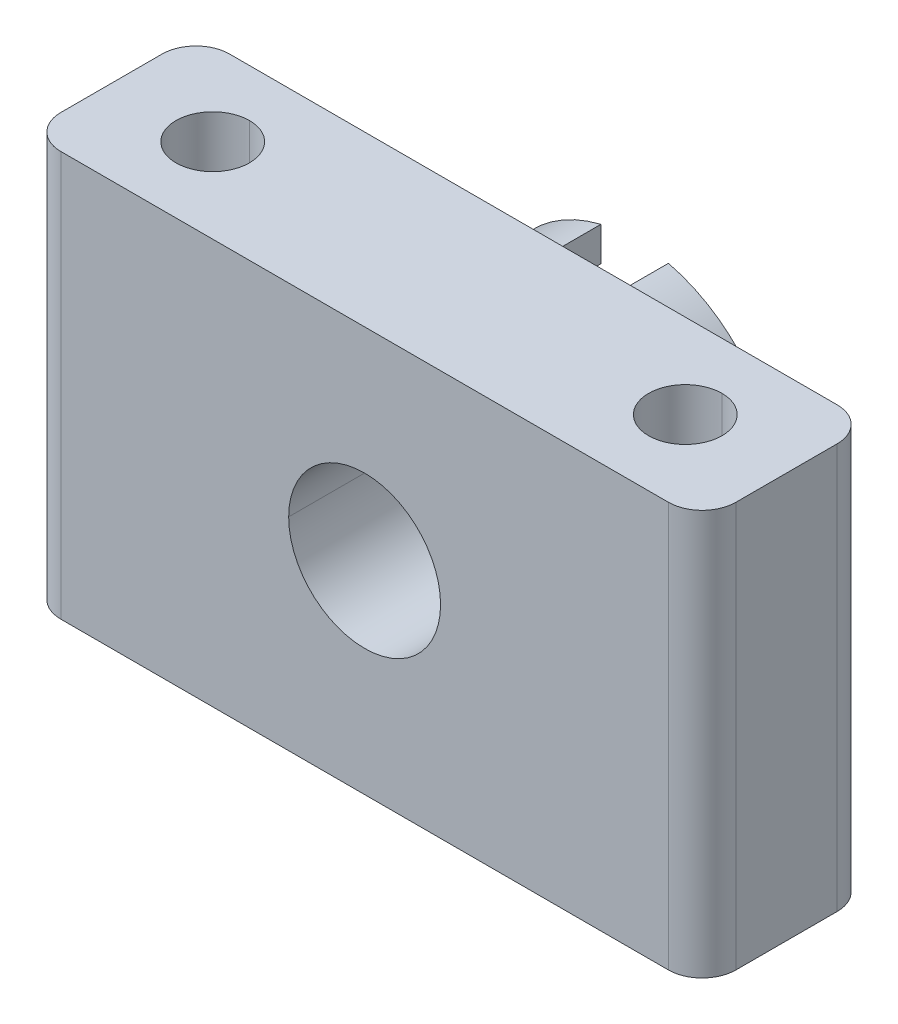
ISO-10303-21;
HEADER;
FILE_DESCRIPTION(('STEP AP214'),'2;1');
FILE_NAME('part.step','',(''),(''),'','','');
FILE_SCHEMA(('AUTOMOTIVE_DESIGN { 1 0 10303 214 1 1 1 1 }'));
ENDSEC;
DATA;
#1=APPLICATION_CONTEXT('core data for automotive mechanical design processes');
#2=APPLICATION_PROTOCOL_DEFINITION('international standard','automotive_design',2000,#1);
#3=PRODUCT_CONTEXT('',#1,'mechanical');
#4=PRODUCT('Part','Part','',(#3));
#5=PRODUCT_RELATED_PRODUCT_CATEGORY('part','',(#4));
#6=PRODUCT_DEFINITION_FORMATION('','',#4);
#7=PRODUCT_DEFINITION_CONTEXT('part definition',#1,'design');
#8=PRODUCT_DEFINITION('design','',#6,#7);
#9=PRODUCT_DEFINITION_SHAPE('','',#8);
#10=(LENGTH_UNIT() NAMED_UNIT(*) SI_UNIT(.MILLI.,.METRE.));
#11=(NAMED_UNIT(*) PLANE_ANGLE_UNIT() SI_UNIT($,.RADIAN.));
#12=(NAMED_UNIT(*) SI_UNIT($,.STERADIAN.) SOLID_ANGLE_UNIT());
#13=UNCERTAINTY_MEASURE_WITH_UNIT(LENGTH_MEASURE(1.E-05),#10,'distance_accuracy_value','');
#14=(GEOMETRIC_REPRESENTATION_CONTEXT(3) GLOBAL_UNCERTAINTY_ASSIGNED_CONTEXT((#13)) GLOBAL_UNIT_ASSIGNED_CONTEXT((#10,
#11,#12)) REPRESENTATION_CONTEXT('',''));
#15=CARTESIAN_POINT('',(0.,0.,0.));
#16=DIRECTION('',(0.,0.,1.));
#17=DIRECTION('',(1.,0.,0.));
#18=AXIS2_PLACEMENT_3D('',#15,#16,#17);
#19=CARTESIAN_POINT('',(-14.,-28.,11.));
#20=DIRECTION('',(0.,1.,0.));
#21=DIRECTION('',(0.,0.,1.));
#22=AXIS2_PLACEMENT_3D('',#19,#20,#21);
#23=CYLINDRICAL_SURFACE('',#22,2.175);
#24=CARTESIAN_POINT('',(-14.,-12.,11.));
#25=DIRECTION('',(0.,1.,0.));
#26=DIRECTION('',(0.,0.,1.));
#27=AXIS2_PLACEMENT_3D('',#24,#25,#26);
#28=CIRCLE('',#27,2.175);
#29=CARTESIAN_POINT('',(-14.,-12.,8.825));
#30=VERTEX_POINT('',#29);
#31=CARTESIAN_POINT('',(-14.,-12.,13.175));
#32=VERTEX_POINT('',#31);
#33=EDGE_CURVE('E302',#30,#32,#28,.T.);
#34=ORIENTED_EDGE('',*,*,#33,.F.);
#35=DIRECTION('',(0.,1.,0.));
#36=VECTOR('',#35,1.);
#37=CARTESIAN_POINT('',(-14.,-28.,8.825));
#38=LINE('',#37,#36);
#39=CARTESIAN_POINT('',(-14.,12.,8.825));
#40=VERTEX_POINT('',#39);
#41=EDGE_CURVE('E232',#30,#40,#38,.T.);
#42=ORIENTED_EDGE('',*,*,#41,.T.);
#43=CARTESIAN_POINT('',(-14.,12.,11.));
#44=DIRECTION('',(0.,1.,0.));
#45=DIRECTION('',(0.,0.,1.));
#46=AXIS2_PLACEMENT_3D('',#43,#44,#45);
#47=CIRCLE('',#46,2.175);
#48=CARTESIAN_POINT('',(-14.,12.,13.175));
#49=VERTEX_POINT('',#48);
#50=EDGE_CURVE('E11',#40,#49,#47,.T.);
#51=ORIENTED_EDGE('',*,*,#50,.T.);
#52=DIRECTION('',(0.,1.,0.));
#53=VECTOR('',#52,1.);
#54=CARTESIAN_POINT('',(-14.,-28.,13.175));
#55=LINE('',#54,#53);
#56=EDGE_CURVE('E291',#32,#49,#55,.T.);
#57=ORIENTED_EDGE('',*,*,#56,.F.);
#58=EDGE_LOOP('',(#34,#42,#51,#57));
#59=FACE_BOUND('',#58,.T.);
#60=ADVANCED_FACE('F16',(#59),#23,.F.);
#61=CARTESIAN_POINT('',(14.,-28.,11.));
#62=DIRECTION('',(0.,1.,0.));
#63=DIRECTION('',(0.,0.,1.));
#64=AXIS2_PLACEMENT_3D('',#61,#62,#63);
#65=CYLINDRICAL_SURFACE('',#64,2.175);
#66=CARTESIAN_POINT('',(14.,-12.,11.));
#67=DIRECTION('',(0.,1.,0.));
#68=DIRECTION('',(0.,0.,1.));
#69=AXIS2_PLACEMENT_3D('',#66,#67,#68);
#70=CIRCLE('',#69,2.175);
#71=CARTESIAN_POINT('',(14.,-12.,8.825));
#72=VERTEX_POINT('',#71);
#73=CARTESIAN_POINT('',(14.,-12.,13.175));
#74=VERTEX_POINT('',#73);
#75=EDGE_CURVE('E299',#72,#74,#70,.T.);
#76=ORIENTED_EDGE('',*,*,#75,.F.);
#77=DIRECTION('',(0.,1.,0.));
#78=VECTOR('',#77,1.);
#79=CARTESIAN_POINT('',(14.,-28.,8.825));
#80=LINE('',#79,#78);
#81=CARTESIAN_POINT('',(14.,12.,8.825));
#82=VERTEX_POINT('',#81);
#83=EDGE_CURVE('E290',#72,#82,#80,.T.);
#84=ORIENTED_EDGE('',*,*,#83,.T.);
#85=CARTESIAN_POINT('',(14.,12.,11.));
#86=DIRECTION('',(0.,1.,0.));
#87=DIRECTION('',(0.,0.,-1.));
#88=AXIS2_PLACEMENT_3D('',#85,#86,#87);
#89=CIRCLE('',#88,2.175);
#90=CARTESIAN_POINT('',(14.,12.,13.175));
#91=VERTEX_POINT('',#90);
#92=EDGE_CURVE('E27',#82,#91,#89,.T.);
#93=ORIENTED_EDGE('',*,*,#92,.T.);
#94=DIRECTION('',(0.,1.,0.));
#95=VECTOR('',#94,1.);
#96=CARTESIAN_POINT('',(14.,-28.,13.175));
#97=LINE('',#96,#95);
#98=EDGE_CURVE('E383',#74,#91,#97,.T.);
#99=ORIENTED_EDGE('',*,*,#98,.F.);
#100=EDGE_LOOP('',(#76,#84,#93,#99));
#101=FACE_BOUND('',#100,.T.);
#102=ADVANCED_FACE('F502',(#101),#65,.F.);
#103=CARTESIAN_POINT('',(0.,0.,18.));
#104=DIRECTION('',(0.,0.,-1.));
#105=DIRECTION('',(-1.,0.,0.));
#106=AXIS2_PLACEMENT_3D('',#103,#104,#105);
#107=CYLINDRICAL_SURFACE('',#106,4.5);
#108=CARTESIAN_POINT('',(0.,0.,16.));
#109=DIRECTION('',(0.,0.,-1.));
#110=DIRECTION('',(-1.,0.,0.));
#111=AXIS2_PLACEMENT_3D('',#108,#109,#110);
#112=CIRCLE('',#111,4.5);
#113=CARTESIAN_POINT('',(4.5,0.,16.));
#114=VERTEX_POINT('',#113);
#115=CARTESIAN_POINT('',(-4.5,0.,16.));
#116=VERTEX_POINT('',#115);
#117=EDGE_CURVE('E242',#114,#116,#112,.T.);
#118=ORIENTED_EDGE('',*,*,#117,.F.);
#119=DIRECTION('',(0.,0.,-1.));
#120=VECTOR('',#119,1.);
#121=CARTESIAN_POINT('',(4.5,0.,18.));
#122=LINE('',#121,#120);
#123=CARTESIAN_POINT('',(4.5,0.,9.));
#124=VERTEX_POINT('',#123);
#125=EDGE_CURVE('E339',#114,#124,#122,.T.);
#126=ORIENTED_EDGE('',*,*,#125,.T.);
#127=CARTESIAN_POINT('',(0.,0.,9.));
#128=DIRECTION('',(0.,0.,-1.));
#129=DIRECTION('',(-1.,0.,0.));
#130=AXIS2_PLACEMENT_3D('',#127,#128,#129);
#131=CIRCLE('',#130,4.5);
#132=CARTESIAN_POINT('',(-4.5,0.,9.));
#133=VERTEX_POINT('',#132);
#134=EDGE_CURVE('E248',#124,#133,#131,.T.);
#135=ORIENTED_EDGE('',*,*,#134,.T.);
#136=DIRECTION('',(0.,0.,-1.));
#137=VECTOR('',#136,1.);
#138=CARTESIAN_POINT('',(-4.5,0.,18.));
#139=LINE('',#138,#137);
#140=EDGE_CURVE('E371',#116,#133,#139,.T.);
#141=ORIENTED_EDGE('',*,*,#140,.F.);
#142=EDGE_LOOP('',(#118,#126,#135,#141));
#143=FACE_BOUND('',#142,.T.);
#144=ADVANCED_FACE('F561',(#143),#107,.F.);
#145=CARTESIAN_POINT('',(0.,0.,-2.00000000000003));
#146=DIRECTION('',(0.,0.,1.));
#147=DIRECTION('',(1.,0.,0.));
#148=AXIS2_PLACEMENT_3D('',#145,#146,#147);
#149=CYLINDRICAL_SURFACE('',#148,8.5);
#150=CARTESIAN_POINT('',(0.,0.,0.));
#151=DIRECTION('',(0.,0.,-1.));
#152=DIRECTION('',(-1.,0.,0.));
#153=AXIS2_PLACEMENT_3D('',#150,#151,#152);
#154=CIRCLE('',#153,8.5);
#155=CARTESIAN_POINT('',(8.5,0.,0.));
#156=VERTEX_POINT('',#155);
#157=CARTESIAN_POINT('',(2.,-8.26135582092915,0.));
#158=VERTEX_POINT('',#157);
#159=EDGE_CURVE('E261',#156,#158,#154,.T.);
#160=ORIENTED_EDGE('',*,*,#159,.F.);
#161=DIRECTION('',(0.,0.,1.));
#162=VECTOR('',#161,1.);
#163=CARTESIAN_POINT('',(8.5,0.,-2.00000000000003));
#164=LINE('',#163,#162);
#165=CARTESIAN_POINT('',(8.5,0.,6.));
#166=VERTEX_POINT('',#165);
#167=EDGE_CURVE('E42',#156,#166,#164,.T.);
#168=ORIENTED_EDGE('',*,*,#167,.T.);
#169=CARTESIAN_POINT('',(0.,0.,6.));
#170=DIRECTION('',(0.,0.,1.));
#171=DIRECTION('',(1.,0.,0.));
#172=AXIS2_PLACEMENT_3D('',#169,#170,#171);
#173=CIRCLE('',#172,8.5);
#174=CARTESIAN_POINT('',(2.,-8.26135582092915,6.));
#175=VERTEX_POINT('',#174);
#176=EDGE_CURVE('E208',#175,#166,#173,.T.);
#177=ORIENTED_EDGE('',*,*,#176,.F.);
#178=DIRECTION('',(0.,0.,1.));
#179=VECTOR('',#178,1.);
#180=CARTESIAN_POINT('',(2.,-8.26135582092915,-2.00000000000003));
#181=LINE('',#180,#179);
#182=EDGE_CURVE('E200',#158,#175,#181,.T.);
#183=ORIENTED_EDGE('',*,*,#182,.F.);
#184=EDGE_LOOP('',(#160,#168,#177,#183));
#185=FACE_BOUND('',#184,.T.);
#186=ADVANCED_FACE('F919',(#185),#149,.T.);
#187=CARTESIAN_POINT('',(0.,0.,-2.00000000000003));
#188=DIRECTION('',(0.,0.,1.));
#189=DIRECTION('',(1.,0.,0.));
#190=AXIS2_PLACEMENT_3D('',#187,#188,#189);
#191=CYLINDRICAL_SURFACE('',#190,6.55);
#192=CARTESIAN_POINT('',(0.,0.,0.));
#193=DIRECTION('',(0.,0.,1.));
#194=DIRECTION('',(-1.,0.,0.));
#195=AXIS2_PLACEMENT_3D('',#192,#193,#194);
#196=CIRCLE('',#195,6.55);
#197=CARTESIAN_POINT('',(-6.55,0.,0.));
#198=VERTEX_POINT('',#197);
#199=CARTESIAN_POINT('',(-2.,-6.23718686588753,0.));
#200=VERTEX_POINT('',#199);
#201=EDGE_CURVE('E369',#198,#200,#196,.T.);
#202=ORIENTED_EDGE('',*,*,#201,.F.);
#203=DIRECTION('',(0.,0.,1.));
#204=VECTOR('',#203,1.);
#205=CARTESIAN_POINT('',(-6.55,0.,-2.00000000000003));
#206=LINE('',#205,#204);
#207=CARTESIAN_POINT('',(-6.55,0.,9.));
#208=VERTEX_POINT('',#207);
#209=EDGE_CURVE('E351',#198,#208,#206,.T.);
#210=ORIENTED_EDGE('',*,*,#209,.T.);
#211=CARTESIAN_POINT('',(0.,0.,9.));
#212=DIRECTION('',(0.,0.,-1.));
#213=DIRECTION('',(-1.,0.,0.));
#214=AXIS2_PLACEMENT_3D('',#211,#212,#213);
#215=CIRCLE('',#214,6.55);
#216=CARTESIAN_POINT('',(6.55,0.,9.));
#217=VERTEX_POINT('',#216);
#218=EDGE_CURVE('E356',#217,#208,#215,.T.);
#219=ORIENTED_EDGE('',*,*,#218,.F.);
#220=DIRECTION('',(0.,0.,1.));
#221=VECTOR('',#220,1.);
#222=CARTESIAN_POINT('',(6.55,0.,-2.00000000000003));
#223=LINE('',#222,#221);
#224=CARTESIAN_POINT('',(6.55,0.,0.));
#225=VERTEX_POINT('',#224);
#226=EDGE_CURVE('E350',#225,#217,#223,.T.);
#227=ORIENTED_EDGE('',*,*,#226,.F.);
#228=CARTESIAN_POINT('',(0.,0.,0.));
#229=DIRECTION('',(0.,0.,1.));
#230=DIRECTION('',(-1.,0.,0.));
#231=AXIS2_PLACEMENT_3D('',#228,#229,#230);
#232=CIRCLE('',#231,6.55);
#233=CARTESIAN_POINT('',(2.,-6.23718686588753,0.));
#234=VERTEX_POINT('',#233);
#235=EDGE_CURVE('E195',#234,#225,#232,.T.);
#236=ORIENTED_EDGE('',*,*,#235,.F.);
#237=DIRECTION('',(0.,0.,1.));
#238=VECTOR('',#237,1.);
#239=CARTESIAN_POINT('',(2.,-6.23718686588753,-2.00000000000003));
#240=LINE('',#239,#238);
#241=CARTESIAN_POINT('',(2.,-6.23718686588754,6.));
#242=VERTEX_POINT('',#241);
#243=EDGE_CURVE('E187',#234,#242,#240,.T.);
#244=ORIENTED_EDGE('',*,*,#243,.T.);
#245=CARTESIAN_POINT('',(0.,0.,6.));
#246=DIRECTION('',(0.,0.,1.));
#247=DIRECTION('',(1.,0.,0.));
#248=AXIS2_PLACEMENT_3D('',#245,#246,#247);
#249=CIRCLE('',#248,6.55);
#250=CARTESIAN_POINT('',(-2.,-6.23718686588754,6.));
#251=VERTEX_POINT('',#250);
#252=EDGE_CURVE('E192',#251,#242,#249,.T.);
#253=ORIENTED_EDGE('',*,*,#252,.F.);
#254=DIRECTION('',(0.,0.,1.));
#255=VECTOR('',#254,1.);
#256=CARTESIAN_POINT('',(-2.,-6.23718686588753,-2.00000000000003));
#257=LINE('',#256,#255);
#258=EDGE_CURVE('E394',#200,#251,#257,.T.);
#259=ORIENTED_EDGE('',*,*,#258,.F.);
#260=EDGE_LOOP('',(#202,#210,#219,#227,#236,#244,#253,#259));
#261=FACE_BOUND('',#260,.T.);
#262=ADVANCED_FACE('F190',(#261),#191,.F.);
#263=CARTESIAN_POINT('',(-20.,12.,16.));
#264=DIRECTION('',(0.,1.,0.));
#265=DIRECTION('',(1.,0.,0.));
#266=AXIS2_PLACEMENT_3D('',#263,#264,#265);
#267=PLANE('',#266);
#268=CARTESIAN_POINT('',(-14.,12.,11.));
#269=DIRECTION('',(0.,1.,0.));
#270=DIRECTION('',(0.,0.,1.));
#271=AXIS2_PLACEMENT_3D('',#268,#269,#270);
#272=CIRCLE('',#271,2.175);
#273=EDGE_CURVE('E286',#49,#40,#272,.T.);
#274=ORIENTED_EDGE('',*,*,#273,.F.);
#275=ORIENTED_EDGE('',*,*,#50,.F.);
#276=EDGE_LOOP('',(#274,#275));
#277=FACE_BOUND('',#276,.T.);
#278=CARTESIAN_POINT('',(14.,12.,11.));
#279=DIRECTION('',(0.,1.,0.));
#280=DIRECTION('',(0.,0.,-1.));
#281=AXIS2_PLACEMENT_3D('',#278,#279,#280);
#282=CIRCLE('',#281,2.175);
#283=EDGE_CURVE('E343',#91,#82,#282,.T.);
#284=ORIENTED_EDGE('',*,*,#283,.F.);
#285=ORIENTED_EDGE('',*,*,#92,.F.);
#286=EDGE_LOOP('',(#284,#285));
#287=FACE_BOUND('',#286,.T.);
#288=DIRECTION('',(0.,0.,-1.));
#289=VECTOR('',#288,1.);
#290=CARTESIAN_POINT('',(20.,12.,16.));
#291=LINE('',#290,#289);
#292=CARTESIAN_POINT('',(20.,12.,14.));
#293=VERTEX_POINT('',#292);
#294=CARTESIAN_POINT('',(20.,12.,8.));
#295=VERTEX_POINT('',#294);
#296=EDGE_CURVE('E114',#293,#295,#291,.T.);
#297=ORIENTED_EDGE('',*,*,#296,.T.);
#298=CARTESIAN_POINT('',(18.,12.,8.));
#299=DIRECTION('',(0.,1.,0.));
#300=DIRECTION('',(-1.,0.,0.));
#301=AXIS2_PLACEMENT_3D('',#298,#299,#300);
#302=CIRCLE('',#301,2.);
#303=CARTESIAN_POINT('',(18.,12.,6.));
#304=VERTEX_POINT('',#303);
#305=EDGE_CURVE('E233',#295,#304,#302,.T.);
#306=ORIENTED_EDGE('',*,*,#305,.T.);
#307=DIRECTION('',(-1.,0.,0.));
#308=VECTOR('',#307,1.);
#309=CARTESIAN_POINT('',(-20.,12.,6.));
#310=LINE('',#309,#308);
#311=CARTESIAN_POINT('',(-18.,12.,6.));
#312=VERTEX_POINT('',#311);
#313=EDGE_CURVE('E271',#304,#312,#310,.T.);
#314=ORIENTED_EDGE('',*,*,#313,.T.);
#315=CARTESIAN_POINT('',(-18.,12.,8.));
#316=DIRECTION('',(0.,1.,0.));
#317=DIRECTION('',(-1.,0.,0.));
#318=AXIS2_PLACEMENT_3D('',#315,#316,#317);
#319=CIRCLE('',#318,2.);
#320=CARTESIAN_POINT('',(-20.,12.,8.));
#321=VERTEX_POINT('',#320);
#322=EDGE_CURVE('E331',#312,#321,#319,.T.);
#323=ORIENTED_EDGE('',*,*,#322,.T.);
#324=DIRECTION('',(0.,0.,-1.));
#325=VECTOR('',#324,1.);
#326=CARTESIAN_POINT('',(-20.,12.,16.));
#327=LINE('',#326,#325);
#328=CARTESIAN_POINT('',(-20.,12.,14.));
#329=VERTEX_POINT('',#328);
#330=EDGE_CURVE('E319',#329,#321,#327,.T.);
#331=ORIENTED_EDGE('',*,*,#330,.F.);
#332=CARTESIAN_POINT('',(-18.,12.,14.));
#333=DIRECTION('',(0.,1.,0.));
#334=DIRECTION('',(-1.,0.,0.));
#335=AXIS2_PLACEMENT_3D('',#332,#333,#334);
#336=CIRCLE('',#335,2.);
#337=CARTESIAN_POINT('',(-18.,12.,16.));
#338=VERTEX_POINT('',#337);
#339=EDGE_CURVE('E442',#329,#338,#336,.T.);
#340=ORIENTED_EDGE('',*,*,#339,.T.);
#341=DIRECTION('',(1.,0.,0.));
#342=VECTOR('',#341,1.);
#343=CARTESIAN_POINT('',(-20.,12.,16.));
#344=LINE('',#343,#342);
#345=CARTESIAN_POINT('',(18.,12.,16.));
#346=VERTEX_POINT('',#345);
#347=EDGE_CURVE('E239',#338,#346,#344,.T.);
#348=ORIENTED_EDGE('',*,*,#347,.T.);
#349=CARTESIAN_POINT('',(18.,12.,14.));
#350=DIRECTION('',(0.,1.,0.));
#351=DIRECTION('',(-1.,0.,0.));
#352=AXIS2_PLACEMENT_3D('',#349,#350,#351);
#353=CIRCLE('',#352,2.);
#354=EDGE_CURVE('E20',#346,#293,#353,.T.);
#355=ORIENTED_EDGE('',*,*,#354,.T.);
#356=EDGE_LOOP('',(#297,#306,#314,#323,#331,#340,#348,#355));
#357=FACE_BOUND('',#356,.T.);
#358=ADVANCED_FACE('F448',(#277,#287,#357),#267,.T.);
#359=CARTESIAN_POINT('',(-20.,12.,16.));
#360=DIRECTION('',(1.,0.,0.));
#361=DIRECTION('',(0.,1.,0.));
#362=AXIS2_PLACEMENT_3D('',#359,#360,#361);
#363=PLANE('',#362);
#364=ORIENTED_EDGE('',*,*,#330,.T.);
#365=DIRECTION('',(0.,-1.,0.));
#366=VECTOR('',#365,1.);
#367=CARTESIAN_POINT('',(-20.,12.,8.));
#368=LINE('',#367,#366);
#369=CARTESIAN_POINT('',(-20.,-12.,8.));
#370=VERTEX_POINT('',#369);
#371=EDGE_CURVE('E280',#321,#370,#368,.T.);
#372=ORIENTED_EDGE('',*,*,#371,.T.);
#373=DIRECTION('',(0.,0.,-1.));
#374=VECTOR('',#373,1.);
#375=CARTESIAN_POINT('',(-20.,-12.,16.));
#376=LINE('',#375,#374);
#377=CARTESIAN_POINT('',(-20.,-12.,14.));
#378=VERTEX_POINT('',#377);
#379=EDGE_CURVE('E303',#378,#370,#376,.T.);
#380=ORIENTED_EDGE('',*,*,#379,.F.);
#381=DIRECTION('',(0.,1.,0.));
#382=VECTOR('',#381,1.);
#383=CARTESIAN_POINT('',(-20.,12.,14.));
#384=LINE('',#383,#382);
#385=EDGE_CURVE('E364',#378,#329,#384,.T.);
#386=ORIENTED_EDGE('',*,*,#385,.T.);
#387=EDGE_LOOP('',(#364,#372,#380,#386));
#388=FACE_BOUND('',#387,.T.);
#389=ADVANCED_FACE('F467',(#388),#363,.F.);
#390=CARTESIAN_POINT('',(-20.,-12.,16.));
#391=DIRECTION('',(0.,1.,0.));
#392=DIRECTION('',(1.,0.,0.));
#393=AXIS2_PLACEMENT_3D('',#390,#391,#392);
#394=PLANE('',#393);
#395=CARTESIAN_POINT('',(-14.,-12.,11.));
#396=DIRECTION('',(0.,1.,0.));
#397=DIRECTION('',(0.,0.,1.));
#398=AXIS2_PLACEMENT_3D('',#395,#396,#397);
#399=CIRCLE('',#398,2.175);
#400=EDGE_CURVE('E257',#32,#30,#399,.T.);
#401=ORIENTED_EDGE('',*,*,#400,.T.);
#402=ORIENTED_EDGE('',*,*,#33,.T.);
#403=EDGE_LOOP('',(#401,#402));
#404=FACE_BOUND('',#403,.T.);
#405=CARTESIAN_POINT('',(14.,-12.,11.));
#406=DIRECTION('',(0.,1.,0.));
#407=DIRECTION('',(0.,0.,1.));
#408=AXIS2_PLACEMENT_3D('',#405,#406,#407);
#409=CIRCLE('',#408,2.175);
#410=EDGE_CURVE('E360',#74,#72,#409,.T.);
#411=ORIENTED_EDGE('',*,*,#410,.T.);
#412=ORIENTED_EDGE('',*,*,#75,.T.);
#413=EDGE_LOOP('',(#411,#412));
#414=FACE_BOUND('',#413,.T.);
#415=DIRECTION('',(1.,0.,0.));
#416=VECTOR('',#415,1.);
#417=CARTESIAN_POINT('',(-20.,-12.,6.));
#418=LINE('',#417,#416);
#419=CARTESIAN_POINT('',(-18.,-12.,6.));
#420=VERTEX_POINT('',#419);
#421=CARTESIAN_POINT('',(18.,-12.,6.));
#422=VERTEX_POINT('',#421);
#423=EDGE_CURVE('E267',#420,#422,#418,.T.);
#424=ORIENTED_EDGE('',*,*,#423,.T.);
#425=CARTESIAN_POINT('',(18.,-12.,8.));
#426=DIRECTION('',(0.,-1.,0.));
#427=DIRECTION('',(0.,0.,1.));
#428=AXIS2_PLACEMENT_3D('',#425,#426,#427);
#429=CIRCLE('',#428,2.);
#430=CARTESIAN_POINT('',(20.,-12.,8.));
#431=VERTEX_POINT('',#430);
#432=EDGE_CURVE('E275',#422,#431,#429,.T.);
#433=ORIENTED_EDGE('',*,*,#432,.T.);
#434=DIRECTION('',(0.,0.,-1.));
#435=VECTOR('',#434,1.);
#436=CARTESIAN_POINT('',(20.,-12.,16.));
#437=LINE('',#436,#435);
#438=CARTESIAN_POINT('',(20.,-12.,14.));
#439=VERTEX_POINT('',#438);
#440=EDGE_CURVE('E295',#439,#431,#437,.T.);
#441=ORIENTED_EDGE('',*,*,#440,.F.);
#442=CARTESIAN_POINT('',(18.,-12.,14.));
#443=DIRECTION('',(0.,-1.,0.));
#444=DIRECTION('',(0.,0.,1.));
#445=AXIS2_PLACEMENT_3D('',#442,#443,#444);
#446=CIRCLE('',#445,2.);
#447=CARTESIAN_POINT('',(18.,-12.,16.));
#448=VERTEX_POINT('',#447);
#449=EDGE_CURVE('E249',#439,#448,#446,.T.);
#450=ORIENTED_EDGE('',*,*,#449,.T.);
#451=DIRECTION('',(1.,0.,0.));
#452=VECTOR('',#451,1.);
#453=CARTESIAN_POINT('',(-20.,-12.,16.));
#454=LINE('',#453,#452);
#455=CARTESIAN_POINT('',(-18.,-12.,16.));
#456=VERTEX_POINT('',#455);
#457=EDGE_CURVE('E97',#456,#448,#454,.T.);
#458=ORIENTED_EDGE('',*,*,#457,.F.);
#459=CARTESIAN_POINT('',(-18.,-12.,14.));
#460=DIRECTION('',(0.,-1.,0.));
#461=DIRECTION('',(0.,0.,1.));
#462=AXIS2_PLACEMENT_3D('',#459,#460,#461);
#463=CIRCLE('',#462,2.);
#464=EDGE_CURVE('E326',#456,#378,#463,.T.);
#465=ORIENTED_EDGE('',*,*,#464,.T.);
#466=ORIENTED_EDGE('',*,*,#379,.T.);
#467=CARTESIAN_POINT('',(-18.,-12.,8.));
#468=DIRECTION('',(0.,-1.,0.));
#469=DIRECTION('',(0.,0.,1.));
#470=AXIS2_PLACEMENT_3D('',#467,#468,#469);
#471=CIRCLE('',#470,2.);
#472=EDGE_CURVE('E330',#370,#420,#471,.T.);
#473=ORIENTED_EDGE('',*,*,#472,.T.);
#474=EDGE_LOOP('',(#424,#433,#441,#450,#458,#465,#466,#473));
#475=FACE_BOUND('',#474,.T.);
#476=ADVANCED_FACE('F509',(#404,#414,#475),#394,.F.);
#477=CARTESIAN_POINT('',(20.,12.,16.));
#478=DIRECTION('',(1.,0.,0.));
#479=DIRECTION('',(0.,-1.,0.));
#480=AXIS2_PLACEMENT_3D('',#477,#478,#479);
#481=PLANE('',#480);
#482=ORIENTED_EDGE('',*,*,#440,.T.);
#483=DIRECTION('',(0.,1.,0.));
#484=VECTOR('',#483,1.);
#485=CARTESIAN_POINT('',(20.,12.,8.));
#486=LINE('',#485,#484);
#487=EDGE_CURVE('E229',#431,#295,#486,.T.);
#488=ORIENTED_EDGE('',*,*,#487,.T.);
#489=ORIENTED_EDGE('',*,*,#296,.F.);
#490=DIRECTION('',(0.,-1.,0.));
#491=VECTOR('',#490,1.);
#492=CARTESIAN_POINT('',(20.,-12.,14.));
#493=LINE('',#492,#491);
#494=EDGE_CURVE('E252',#293,#439,#493,.T.);
#495=ORIENTED_EDGE('',*,*,#494,.T.);
#496=EDGE_LOOP('',(#482,#488,#489,#495));
#497=FACE_BOUND('',#496,.T.);
#498=ADVANCED_FACE('F871',(#497),#481,.T.);
#499=CARTESIAN_POINT('',(0.,0.,16.));
#500=DIRECTION('',(0.,0.,-1.));
#501=DIRECTION('',(0.,-1.,0.));
#502=AXIS2_PLACEMENT_3D('',#499,#500,#501);
#503=PLANE('',#502);
#504=CARTESIAN_POINT('',(0.,0.,16.));
#505=DIRECTION('',(0.,0.,-1.));
#506=DIRECTION('',(-1.,0.,0.));
#507=AXIS2_PLACEMENT_3D('',#504,#505,#506);
#508=CIRCLE('',#507,4.5);
#509=EDGE_CURVE('E227',#116,#114,#508,.T.);
#510=ORIENTED_EDGE('',*,*,#509,.T.);
#511=ORIENTED_EDGE('',*,*,#117,.T.);
#512=EDGE_LOOP('',(#510,#511));
#513=FACE_BOUND('',#512,.T.);
#514=ORIENTED_EDGE('',*,*,#457,.T.);
#515=DIRECTION('',(0.,1.,0.));
#516=VECTOR('',#515,1.);
#517=CARTESIAN_POINT('',(18.,12.,16.));
#518=LINE('',#517,#516);
#519=EDGE_CURVE('E253',#448,#346,#518,.T.);
#520=ORIENTED_EDGE('',*,*,#519,.T.);
#521=ORIENTED_EDGE('',*,*,#347,.F.);
#522=DIRECTION('',(0.,-1.,0.));
#523=VECTOR('',#522,1.);
#524=CARTESIAN_POINT('',(-18.,0.,16.));
#525=LINE('',#524,#523);
#526=EDGE_CURVE('E323',#338,#456,#525,.T.);
#527=ORIENTED_EDGE('',*,*,#526,.T.);
#528=EDGE_LOOP('',(#514,#520,#521,#527));
#529=FACE_BOUND('',#528,.T.);
#530=ADVANCED_FACE('F565',(#513,#529),#503,.F.);
#531=CARTESIAN_POINT('',(0.,0.,-2.00000000000003));
#532=DIRECTION('',(0.,0.,1.));
#533=DIRECTION('',(1.,0.,0.));
#534=AXIS2_PLACEMENT_3D('',#531,#532,#533);
#535=CYLINDRICAL_SURFACE('',#534,8.5);
#536=DIRECTION('',(0.,0.,1.));
#537=VECTOR('',#536,1.);
#538=CARTESIAN_POINT('',(-2.,-8.26135582092915,-2.00000000000003));
#539=LINE('',#538,#537);
#540=CARTESIAN_POINT('',(-2.,-8.26135582092915,0.));
#541=VERTEX_POINT('',#540);
#542=CARTESIAN_POINT('',(-2.,-8.26135582092915,6.));
#543=VERTEX_POINT('',#542);
#544=EDGE_CURVE('E396',#541,#543,#539,.T.);
#545=ORIENTED_EDGE('',*,*,#544,.T.);
#546=CARTESIAN_POINT('',(0.,0.,6.));
#547=DIRECTION('',(0.,0.,1.));
#548=DIRECTION('',(1.,0.,0.));
#549=AXIS2_PLACEMENT_3D('',#546,#547,#548);
#550=CIRCLE('',#549,8.5);
#551=CARTESIAN_POINT('',(-2.,8.26135582092916,6.));
#552=VERTEX_POINT('',#551);
#553=EDGE_CURVE('E223',#552,#543,#550,.T.);
#554=ORIENTED_EDGE('',*,*,#553,.F.);
#555=DIRECTION('',(0.,0.,1.));
#556=VECTOR('',#555,1.);
#557=CARTESIAN_POINT('',(-2.,8.26135582092916,-2.00000000000003));
#558=LINE('',#557,#556);
#559=CARTESIAN_POINT('',(-2.,8.26135582092916,0.));
#560=VERTEX_POINT('',#559);
#561=EDGE_CURVE('E285',#560,#552,#558,.T.);
#562=ORIENTED_EDGE('',*,*,#561,.F.);
#563=CARTESIAN_POINT('',(0.,0.,0.));
#564=DIRECTION('',(0.,0.,-1.));
#565=DIRECTION('',(-1.,0.,0.));
#566=AXIS2_PLACEMENT_3D('',#563,#564,#565);
#567=CIRCLE('',#566,8.5);
#568=EDGE_CURVE('E420',#541,#560,#567,.T.);
#569=ORIENTED_EDGE('',*,*,#568,.F.);
#570=EDGE_LOOP('',(#545,#554,#562,#569));
#571=FACE_BOUND('',#570,.T.);
#572=ADVANCED_FACE('F826',(#571),#535,.T.);
#573=CARTESIAN_POINT('',(-2.,8.26135582092916,-2.00000000000003));
#574=DIRECTION('',(1.,0.,0.));
#575=DIRECTION('',(0.,-1.,0.));
#576=AXIS2_PLACEMENT_3D('',#573,#574,#575);
#577=PLANE('',#576);
#578=ORIENTED_EDGE('',*,*,#561,.T.);
#579=DIRECTION('',(0.,1.,0.));
#580=VECTOR('',#579,1.);
#581=CARTESIAN_POINT('',(-2.,8.26135582092916,6.));
#582=LINE('',#581,#580);
#583=CARTESIAN_POINT('',(-2.,6.23718686588754,6.));
#584=VERTEX_POINT('',#583);
#585=EDGE_CURVE('E274',#584,#552,#582,.T.);
#586=ORIENTED_EDGE('',*,*,#585,.F.);
#587=DIRECTION('',(0.,0.,1.));
#588=VECTOR('',#587,1.);
#589=CARTESIAN_POINT('',(-2.,6.23718686588754,-2.00000000000003));
#590=LINE('',#589,#588);
#591=CARTESIAN_POINT('',(-2.,6.23718686588754,0.));
#592=VERTEX_POINT('',#591);
#593=EDGE_CURVE('E347',#592,#584,#590,.T.);
#594=ORIENTED_EDGE('',*,*,#593,.F.);
#595=DIRECTION('',(0.,-1.,0.));
#596=VECTOR('',#595,1.);
#597=CARTESIAN_POINT('',(-2.,0.,0.));
#598=LINE('',#597,#596);
#599=EDGE_CURVE('E370',#560,#592,#598,.T.);
#600=ORIENTED_EDGE('',*,*,#599,.F.);
#601=EDGE_LOOP('',(#578,#586,#594,#600));
#602=FACE_BOUND('',#601,.T.);
#603=ADVANCED_FACE('F830',(#602),#577,.T.);
#604=CARTESIAN_POINT('',(0.,0.,-2.00000000000003));
#605=DIRECTION('',(0.,0.,1.));
#606=DIRECTION('',(1.,0.,0.));
#607=AXIS2_PLACEMENT_3D('',#604,#605,#606);
#608=CYLINDRICAL_SURFACE('',#607,6.55);
#609=ORIENTED_EDGE('',*,*,#209,.F.);
#610=CARTESIAN_POINT('',(0.,0.,0.));
#611=DIRECTION('',(0.,0.,1.));
#612=DIRECTION('',(-1.,0.,0.));
#613=AXIS2_PLACEMENT_3D('',#610,#611,#612);
#614=CIRCLE('',#613,6.55);
#615=EDGE_CURVE('E365',#592,#198,#614,.T.);
#616=ORIENTED_EDGE('',*,*,#615,.F.);
#617=ORIENTED_EDGE('',*,*,#593,.T.);
#618=CARTESIAN_POINT('',(0.,0.,6.));
#619=DIRECTION('',(0.,0.,-1.));
#620=DIRECTION('',(-1.,0.,0.));
#621=AXIS2_PLACEMENT_3D('',#618,#619,#620);
#622=CIRCLE('',#621,6.55);
#623=CARTESIAN_POINT('',(2.,6.23718686588754,6.));
#624=VERTEX_POINT('',#623);
#625=EDGE_CURVE('E306',#584,#624,#622,.T.);
#626=ORIENTED_EDGE('',*,*,#625,.T.);
#627=DIRECTION('',(0.,0.,1.));
#628=VECTOR('',#627,1.);
#629=CARTESIAN_POINT('',(2.,6.23718686588754,-2.00000000000003));
#630=LINE('',#629,#628);
#631=CARTESIAN_POINT('',(2.,6.23718686588754,0.));
#632=VERTEX_POINT('',#631);
#633=EDGE_CURVE('E238',#632,#624,#630,.T.);
#634=ORIENTED_EDGE('',*,*,#633,.F.);
#635=CARTESIAN_POINT('',(0.,0.,0.));
#636=DIRECTION('',(0.,0.,1.));
#637=DIRECTION('',(-1.,0.,0.));
#638=AXIS2_PLACEMENT_3D('',#635,#636,#637);
#639=CIRCLE('',#638,6.55);
#640=EDGE_CURVE('E262',#225,#632,#639,.T.);
#641=ORIENTED_EDGE('',*,*,#640,.F.);
#642=ORIENTED_EDGE('',*,*,#226,.T.);
#643=CARTESIAN_POINT('',(0.,0.,9.));
#644=DIRECTION('',(0.,0.,-1.));
#645=DIRECTION('',(-1.,0.,0.));
#646=AXIS2_PLACEMENT_3D('',#643,#644,#645);
#647=CIRCLE('',#646,6.55);
#648=EDGE_CURVE('E352',#208,#217,#647,.T.);
#649=ORIENTED_EDGE('',*,*,#648,.F.);
#650=EDGE_LOOP('',(#609,#616,#617,#626,#634,#641,#642,#649));
#651=FACE_BOUND('',#650,.T.);
#652=ADVANCED_FACE('F848',(#651),#608,.F.);
#653=CARTESIAN_POINT('',(-2.,-6.23718686588753,-2.00000000000003));
#654=DIRECTION('',(1.,0.,0.));
#655=DIRECTION('',(0.,1.,0.));
#656=AXIS2_PLACEMENT_3D('',#653,#654,#655);
#657=PLANE('',#656);
#658=ORIENTED_EDGE('',*,*,#258,.T.);
#659=DIRECTION('',(0.,1.,0.));
#660=VECTOR('',#659,1.);
#661=CARTESIAN_POINT('',(-2.,-6.23718686588753,6.));
#662=LINE('',#661,#660);
#663=EDGE_CURVE('E215',#543,#251,#662,.T.);
#664=ORIENTED_EDGE('',*,*,#663,.F.);
#665=ORIENTED_EDGE('',*,*,#544,.F.);
#666=DIRECTION('',(0.,-1.,0.));
#667=VECTOR('',#666,1.);
#668=CARTESIAN_POINT('',(-2.,0.,0.));
#669=LINE('',#668,#667);
#670=EDGE_CURVE('E266',#200,#541,#669,.T.);
#671=ORIENTED_EDGE('',*,*,#670,.F.);
#672=EDGE_LOOP('',(#658,#664,#665,#671));
#673=FACE_BOUND('',#672,.T.);
#674=ADVANCED_FACE('F843',(#673),#657,.T.);
#675=CARTESIAN_POINT('',(0.,0.,-2.00000000000003));
#676=DIRECTION('',(0.,0.,1.));
#677=DIRECTION('',(1.,0.,0.));
#678=AXIS2_PLACEMENT_3D('',#675,#676,#677);
#679=CYLINDRICAL_SURFACE('',#678,8.5);
#680=ORIENTED_EDGE('',*,*,#167,.F.);
#681=CARTESIAN_POINT('',(0.,0.,0.));
#682=DIRECTION('',(0.,0.,-1.));
#683=DIRECTION('',(-1.,0.,0.));
#684=AXIS2_PLACEMENT_3D('',#681,#682,#683);
#685=CIRCLE('',#684,8.5);
#686=CARTESIAN_POINT('',(2.,8.26135582092916,0.));
#687=VERTEX_POINT('',#686);
#688=EDGE_CURVE('E247',#687,#156,#685,.T.);
#689=ORIENTED_EDGE('',*,*,#688,.F.);
#690=DIRECTION('',(0.,0.,1.));
#691=VECTOR('',#690,1.);
#692=CARTESIAN_POINT('',(2.,8.26135582092916,-2.00000000000003));
#693=LINE('',#692,#691);
#694=CARTESIAN_POINT('',(2.,8.26135582092916,6.));
#695=VERTEX_POINT('',#694);
#696=EDGE_CURVE('E294',#687,#695,#693,.T.);
#697=ORIENTED_EDGE('',*,*,#696,.T.);
#698=CARTESIAN_POINT('',(0.,0.,6.));
#699=DIRECTION('',(0.,0.,1.));
#700=DIRECTION('',(1.,0.,0.));
#701=AXIS2_PLACEMENT_3D('',#698,#699,#700);
#702=CIRCLE('',#701,8.5);
#703=EDGE_CURVE('E234',#166,#695,#702,.T.);
#704=ORIENTED_EDGE('',*,*,#703,.F.);
#705=EDGE_LOOP('',(#680,#689,#697,#704));
#706=FACE_BOUND('',#705,.T.);
#707=ADVANCED_FACE('F847',(#706),#679,.T.);
#708=CARTESIAN_POINT('',(2.,-6.23718686588753,-2.00000000000003));
#709=DIRECTION('',(-1.,0.,0.));
#710=DIRECTION('',(0.,1.,0.));
#711=AXIS2_PLACEMENT_3D('',#708,#709,#710);
#712=PLANE('',#711);
#713=ORIENTED_EDGE('',*,*,#182,.T.);
#714=DIRECTION('',(0.,-1.,0.));
#715=VECTOR('',#714,1.);
#716=CARTESIAN_POINT('',(2.,-6.23718686588753,6.));
#717=LINE('',#716,#715);
#718=EDGE_CURVE('E203',#242,#175,#717,.T.);
#719=ORIENTED_EDGE('',*,*,#718,.F.);
#720=ORIENTED_EDGE('',*,*,#243,.F.);
#721=DIRECTION('',(0.,1.,0.));
#722=VECTOR('',#721,1.);
#723=CARTESIAN_POINT('',(2.,0.,0.));
#724=LINE('',#723,#722);
#725=EDGE_CURVE('E344',#158,#234,#724,.T.);
#726=ORIENTED_EDGE('',*,*,#725,.F.);
#727=EDGE_LOOP('',(#713,#719,#720,#726));
#728=FACE_BOUND('',#727,.T.);
#729=ADVANCED_FACE('F204',(#728),#712,.T.);
#730=CARTESIAN_POINT('',(2.,8.26135582092916,-2.00000000000003));
#731=DIRECTION('',(-1.,0.,0.));
#732=DIRECTION('',(0.,0.,1.));
#733=AXIS2_PLACEMENT_3D('',#730,#731,#732);
#734=PLANE('',#733);
#735=ORIENTED_EDGE('',*,*,#633,.T.);
#736=DIRECTION('',(0.,-1.,0.));
#737=VECTOR('',#736,1.);
#738=CARTESIAN_POINT('',(2.,8.26135582092916,6.));
#739=LINE('',#738,#737);
#740=EDGE_CURVE('E270',#695,#624,#739,.T.);
#741=ORIENTED_EDGE('',*,*,#740,.F.);
#742=ORIENTED_EDGE('',*,*,#696,.F.);
#743=DIRECTION('',(0.,1.,0.));
#744=VECTOR('',#743,1.);
#745=CARTESIAN_POINT('',(2.,0.,0.));
#746=LINE('',#745,#744);
#747=EDGE_CURVE('E243',#632,#687,#746,.T.);
#748=ORIENTED_EDGE('',*,*,#747,.F.);
#749=EDGE_LOOP('',(#735,#741,#742,#748));
#750=FACE_BOUND('',#749,.T.);
#751=ADVANCED_FACE('F950',(#750),#734,.T.);
#752=CARTESIAN_POINT('',(0.,0.,6.));
#753=DIRECTION('',(0.,0.,1.));
#754=DIRECTION('',(1.,0.,0.));
#755=AXIS2_PLACEMENT_3D('',#752,#753,#754);
#756=PLANE('',#755);
#757=ORIENTED_EDGE('',*,*,#740,.T.);
#758=ORIENTED_EDGE('',*,*,#625,.F.);
#759=ORIENTED_EDGE('',*,*,#585,.T.);
#760=ORIENTED_EDGE('',*,*,#553,.T.);
#761=ORIENTED_EDGE('',*,*,#663,.T.);
#762=ORIENTED_EDGE('',*,*,#252,.T.);
#763=ORIENTED_EDGE('',*,*,#718,.T.);
#764=ORIENTED_EDGE('',*,*,#176,.T.);
#765=ORIENTED_EDGE('',*,*,#703,.T.);
#766=EDGE_LOOP('',(#757,#758,#759,#760,#761,#762,#763,#764,#765));
#767=FACE_BOUND('',#766,.T.);
#768=ORIENTED_EDGE('',*,*,#313,.F.);
#769=DIRECTION('',(0.,-1.,0.));
#770=VECTOR('',#769,1.);
#771=CARTESIAN_POINT('',(18.,-12.,6.));
#772=LINE('',#771,#770);
#773=EDGE_CURVE('E279',#304,#422,#772,.T.);
#774=ORIENTED_EDGE('',*,*,#773,.T.);
#775=ORIENTED_EDGE('',*,*,#423,.F.);
#776=DIRECTION('',(0.,1.,0.));
#777=VECTOR('',#776,1.);
#778=CARTESIAN_POINT('',(-18.,0.,6.));
#779=LINE('',#778,#777);
#780=EDGE_CURVE('E335',#420,#312,#779,.T.);
#781=ORIENTED_EDGE('',*,*,#780,.T.);
#782=EDGE_LOOP('',(#768,#774,#775,#781));
#783=FACE_BOUND('',#782,.T.);
#784=ADVANCED_FACE('F211',(#767,#783),#756,.F.);
#785=CARTESIAN_POINT('',(0.,0.,0.));
#786=DIRECTION('',(0.,0.,-1.));
#787=DIRECTION('',(0.,-1.,0.));
#788=AXIS2_PLACEMENT_3D('',#785,#786,#787);
#789=PLANE('',#788);
#790=ORIENTED_EDGE('',*,*,#670,.T.);
#791=ORIENTED_EDGE('',*,*,#568,.T.);
#792=ORIENTED_EDGE('',*,*,#599,.T.);
#793=ORIENTED_EDGE('',*,*,#615,.T.);
#794=ORIENTED_EDGE('',*,*,#201,.T.);
#795=EDGE_LOOP('',(#790,#791,#792,#793,#794));
#796=FACE_BOUND('',#795,.T.);
#797=ADVANCED_FACE('F892',(#796),#789,.T.);
#798=CARTESIAN_POINT('',(0.,0.,0.));
#799=DIRECTION('',(0.,0.,-1.));
#800=DIRECTION('',(0.,-1.,0.));
#801=AXIS2_PLACEMENT_3D('',#798,#799,#800);
#802=PLANE('',#801);
#803=ORIENTED_EDGE('',*,*,#747,.T.);
#804=ORIENTED_EDGE('',*,*,#688,.T.);
#805=ORIENTED_EDGE('',*,*,#159,.T.);
#806=ORIENTED_EDGE('',*,*,#725,.T.);
#807=ORIENTED_EDGE('',*,*,#235,.T.);
#808=ORIENTED_EDGE('',*,*,#640,.T.);
#809=EDGE_LOOP('',(#803,#804,#805,#806,#807,#808));
#810=FACE_BOUND('',#809,.T.);
#811=ADVANCED_FACE('F896',(#810),#802,.T.);
#812=CARTESIAN_POINT('',(0.,0.,9.));
#813=DIRECTION('',(0.,0.,-1.));
#814=DIRECTION('',(0.,-1.,0.));
#815=AXIS2_PLACEMENT_3D('',#812,#813,#814);
#816=PLANE('',#815);
#817=CARTESIAN_POINT('',(0.,0.,9.));
#818=DIRECTION('',(0.,0.,-1.));
#819=DIRECTION('',(-1.,0.,0.));
#820=AXIS2_PLACEMENT_3D('',#817,#818,#819);
#821=CIRCLE('',#820,4.5);
#822=EDGE_CURVE('E375',#133,#124,#821,.T.);
#823=ORIENTED_EDGE('',*,*,#822,.F.);
#824=ORIENTED_EDGE('',*,*,#134,.F.);
#825=EDGE_LOOP('',(#823,#824));
#826=FACE_BOUND('',#825,.T.);
#827=ORIENTED_EDGE('',*,*,#218,.T.);
#828=ORIENTED_EDGE('',*,*,#648,.T.);
#829=EDGE_LOOP('',(#827,#828));
#830=FACE_BOUND('',#829,.T.);
#831=ADVANCED_FACE('F551',(#826,#830),#816,.T.);
#832=CARTESIAN_POINT('',(0.,0.,18.));
#833=DIRECTION('',(0.,0.,-1.));
#834=DIRECTION('',(-1.,0.,0.));
#835=AXIS2_PLACEMENT_3D('',#832,#833,#834);
#836=CYLINDRICAL_SURFACE('',#835,4.5);
#837=ORIENTED_EDGE('',*,*,#125,.F.);
#838=ORIENTED_EDGE('',*,*,#509,.F.);
#839=ORIENTED_EDGE('',*,*,#140,.T.);
#840=ORIENTED_EDGE('',*,*,#822,.T.);
#841=EDGE_LOOP('',(#837,#838,#839,#840));
#842=FACE_BOUND('',#841,.T.);
#843=ADVANCED_FACE('F559',(#842),#836,.F.);
#844=CARTESIAN_POINT('',(14.,-28.,11.));
#845=DIRECTION('',(0.,1.,0.));
#846=DIRECTION('',(0.,0.,1.));
#847=AXIS2_PLACEMENT_3D('',#844,#845,#846);
#848=CYLINDRICAL_SURFACE('',#847,2.175);
#849=ORIENTED_EDGE('',*,*,#83,.F.);
#850=ORIENTED_EDGE('',*,*,#410,.F.);
#851=ORIENTED_EDGE('',*,*,#98,.T.);
#852=ORIENTED_EDGE('',*,*,#283,.T.);
#853=EDGE_LOOP('',(#849,#850,#851,#852));
#854=FACE_BOUND('',#853,.T.);
#855=ADVANCED_FACE('F18',(#854),#848,.F.);
#856=CARTESIAN_POINT('',(-14.,-28.,11.));
#857=DIRECTION('',(0.,1.,0.));
#858=DIRECTION('',(0.,0.,1.));
#859=AXIS2_PLACEMENT_3D('',#856,#857,#858);
#860=CYLINDRICAL_SURFACE('',#859,2.175);
#861=ORIENTED_EDGE('',*,*,#41,.F.);
#862=ORIENTED_EDGE('',*,*,#400,.F.);
#863=ORIENTED_EDGE('',*,*,#56,.T.);
#864=ORIENTED_EDGE('',*,*,#273,.T.);
#865=EDGE_LOOP('',(#861,#862,#863,#864));
#866=FACE_BOUND('',#865,.T.);
#867=ADVANCED_FACE('F927',(#866),#860,.F.);
#868=CARTESIAN_POINT('',(18.,12.,8.));
#869=DIRECTION('',(0.,-1.,0.));
#870=DIRECTION('',(1.,0.,0.));
#871=AXIS2_PLACEMENT_3D('',#868,#869,#870);
#872=CYLINDRICAL_SURFACE('',#871,2.);
#873=ORIENTED_EDGE('',*,*,#432,.F.);
#874=ORIENTED_EDGE('',*,*,#773,.F.);
#875=ORIENTED_EDGE('',*,*,#305,.F.);
#876=ORIENTED_EDGE('',*,*,#487,.F.);
#877=EDGE_LOOP('',(#873,#874,#875,#876));
#878=FACE_BOUND('',#877,.T.);
#879=ADVANCED_FACE('F887',(#878),#872,.T.);
#880=CARTESIAN_POINT('',(-18.,12.,8.));
#881=DIRECTION('',(0.,-1.,0.));
#882=DIRECTION('',(1.,0.,0.));
#883=AXIS2_PLACEMENT_3D('',#880,#881,#882);
#884=CYLINDRICAL_SURFACE('',#883,2.);
#885=ORIENTED_EDGE('',*,*,#322,.F.);
#886=ORIENTED_EDGE('',*,*,#780,.F.);
#887=ORIENTED_EDGE('',*,*,#472,.F.);
#888=ORIENTED_EDGE('',*,*,#371,.F.);
#889=EDGE_LOOP('',(#885,#886,#887,#888));
#890=FACE_BOUND('',#889,.T.);
#891=ADVANCED_FACE('F462',(#890),#884,.T.);
#892=CARTESIAN_POINT('',(18.,12.,14.));
#893=DIRECTION('',(0.,1.,0.));
#894=DIRECTION('',(-1.,0.,0.));
#895=AXIS2_PLACEMENT_3D('',#892,#893,#894);
#896=CYLINDRICAL_SURFACE('',#895,2.);
#897=ORIENTED_EDGE('',*,*,#354,.F.);
#898=ORIENTED_EDGE('',*,*,#519,.F.);
#899=ORIENTED_EDGE('',*,*,#449,.F.);
#900=ORIENTED_EDGE('',*,*,#494,.F.);
#901=EDGE_LOOP('',(#897,#898,#899,#900));
#902=FACE_BOUND('',#901,.T.);
#903=ADVANCED_FACE('F886',(#902),#896,.T.);
#904=CARTESIAN_POINT('',(-18.,0.,14.));
#905=DIRECTION('',(0.,-1.,0.));
#906=DIRECTION('',(1.,0.,0.));
#907=AXIS2_PLACEMENT_3D('',#904,#905,#906);
#908=CYLINDRICAL_SURFACE('',#907,2.);
#909=ORIENTED_EDGE('',*,*,#339,.F.);
#910=ORIENTED_EDGE('',*,*,#385,.F.);
#911=ORIENTED_EDGE('',*,*,#464,.F.);
#912=ORIENTED_EDGE('',*,*,#526,.F.);
#913=EDGE_LOOP('',(#909,#910,#911,#912));
#914=FACE_BOUND('',#913,.T.);
#915=ADVANCED_FACE('F944',(#914),#908,.T.);
#916=CLOSED_SHELL('',(#60,#102,#144,#186,#262,#358,#389,#476,#498,#530,#572,#603,#652,#674,#707,
#729,#751,#784,#797,#811,#831,#843,#855,#867,#879,#891,#903,#915));
#917=MANIFOLD_SOLID_BREP('B1',#916);
#918=ADVANCED_BREP_SHAPE_REPRESENTATION('',(#18,#917),#14);
#919=SHAPE_DEFINITION_REPRESENTATION(#9,#918);
ENDSEC;
END-ISO-10303-21;
